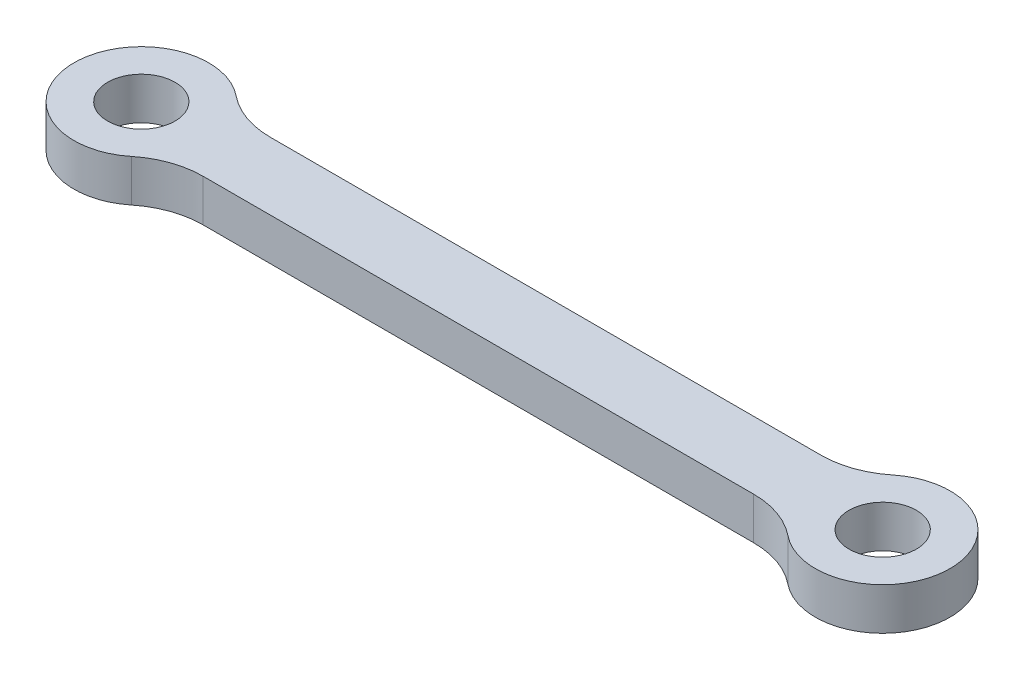
ISO-10303-21;
HEADER;
FILE_DESCRIPTION(('STEP AP214'),'2;1');
FILE_NAME('part.step','',(''),(''),'','','');
FILE_SCHEMA(('AUTOMOTIVE_DESIGN { 1 0 10303 214 1 1 1 1 }'));
ENDSEC;
DATA;
#1=APPLICATION_CONTEXT('core data for automotive mechanical design processes');
#2=APPLICATION_PROTOCOL_DEFINITION('international standard','automotive_design',2000,#1);
#3=PRODUCT_CONTEXT('',#1,'mechanical');
#4=PRODUCT('Part','Part','',(#3));
#5=PRODUCT_RELATED_PRODUCT_CATEGORY('part','',(#4));
#6=PRODUCT_DEFINITION_FORMATION('','',#4);
#7=PRODUCT_DEFINITION_CONTEXT('part definition',#1,'design');
#8=PRODUCT_DEFINITION('design','',#6,#7);
#9=PRODUCT_DEFINITION_SHAPE('','',#8);
#10=(LENGTH_UNIT() NAMED_UNIT(*) SI_UNIT(.MILLI.,.METRE.));
#11=(NAMED_UNIT(*) PLANE_ANGLE_UNIT() SI_UNIT($,.RADIAN.));
#12=(NAMED_UNIT(*) SI_UNIT($,.STERADIAN.) SOLID_ANGLE_UNIT());
#13=UNCERTAINTY_MEASURE_WITH_UNIT(LENGTH_MEASURE(1.E-05),#10,'distance_accuracy_value','');
#14=(GEOMETRIC_REPRESENTATION_CONTEXT(3) GLOBAL_UNCERTAINTY_ASSIGNED_CONTEXT((#13)) GLOBAL_UNIT_ASSIGNED_CONTEXT((#10,
#11,#12)) REPRESENTATION_CONTEXT('',''));
#15=CARTESIAN_POINT('',(0.,0.,0.));
#16=DIRECTION('',(0.,0.,1.));
#17=DIRECTION('',(1.,0.,0.));
#18=AXIS2_PLACEMENT_3D('',#15,#16,#17);
#19=CARTESIAN_POINT('',(-44.,5.,0.));
#20=DIRECTION('',(0.,1.,0.));
#21=DIRECTION('',(0.,0.,1.));
#22=AXIS2_PLACEMENT_3D('',#19,#20,#21);
#23=PLANE('',#22);
#24=CARTESIAN_POINT('',(-44.,5.,0.));
#25=DIRECTION('',(0.,1.,0.));
#26=DIRECTION('',(0.,0.,1.));
#27=AXIS2_PLACEMENT_3D('',#24,#25,#26);
#28=CIRCLE('',#27,4.);
#29=CARTESIAN_POINT('',(-44.,5.,4.));
#30=VERTEX_POINT('',#29);
#31=EDGE_CURVE('E161',#30,#30,#28,.T.);
#32=ORIENTED_EDGE('',*,*,#31,.F.);
#33=EDGE_LOOP('',(#32));
#34=FACE_BOUND('',#33,.T.);
#35=DIRECTION('',(-1.,0.,0.));
#36=VECTOR('',#35,1.);
#37=CARTESIAN_POINT('',(37.0717967697245,5.,-4.));
#38=LINE('',#37,#36);
#39=CARTESIAN_POINT('',(32.6862915010152,5.,-4.));
#40=VERTEX_POINT('',#39);
#41=CARTESIAN_POINT('',(-32.6862915010152,5.,-4.));
#42=VERTEX_POINT('',#41);
#43=EDGE_CURVE('E138',#40,#42,#38,.T.);
#44=ORIENTED_EDGE('',*,*,#43,.T.);
#45=CARTESIAN_POINT('',(-32.6862915010152,5.,-14.));
#46=DIRECTION('',(0.,1.,0.));
#47=DIRECTION('',(0.,0.,1.));
#48=AXIS2_PLACEMENT_3D('',#45,#46,#47);
#49=CIRCLE('',#48,10.);
#50=CARTESIAN_POINT('',(-38.9716851115623,5.,-6.22222222222222));
#51=VERTEX_POINT('',#50);
#52=EDGE_CURVE('E55',#42,#51,#49,.F.);
#53=ORIENTED_EDGE('',*,*,#52,.T.);
#54=CARTESIAN_POINT('',(-44.,5.,0.));
#55=DIRECTION('',(0.,1.,0.));
#56=DIRECTION('',(0.,0.,1.));
#57=AXIS2_PLACEMENT_3D('',#54,#55,#56);
#58=CIRCLE('',#57,8.);
#59=CARTESIAN_POINT('',(-38.9716851115623,5.,6.22222222222223));
#60=VERTEX_POINT('',#59);
#61=EDGE_CURVE('E132',#51,#60,#58,.T.);
#62=ORIENTED_EDGE('',*,*,#61,.T.);
#63=CARTESIAN_POINT('',(-32.6862915010152,5.,14.));
#64=DIRECTION('',(0.,1.,0.));
#65=DIRECTION('',(0.,0.,1.));
#66=AXIS2_PLACEMENT_3D('',#63,#64,#65);
#67=CIRCLE('',#66,10.);
#68=CARTESIAN_POINT('',(-32.6862915010152,5.,4.));
#69=VERTEX_POINT('',#68);
#70=EDGE_CURVE('E11',#60,#69,#67,.F.);
#71=ORIENTED_EDGE('',*,*,#70,.T.);
#72=DIRECTION('',(1.,0.,0.));
#73=VECTOR('',#72,1.);
#74=CARTESIAN_POINT('',(37.0717967697245,5.,3.99999999999999));
#75=LINE('',#74,#73);
#76=CARTESIAN_POINT('',(32.6862915010152,5.,3.99999999999999));
#77=VERTEX_POINT('',#76);
#78=EDGE_CURVE('E166',#69,#77,#75,.T.);
#79=ORIENTED_EDGE('',*,*,#78,.T.);
#80=CARTESIAN_POINT('',(32.6862915010152,5.,14.));
#81=DIRECTION('',(0.,1.,0.));
#82=DIRECTION('',(0.,0.,1.));
#83=AXIS2_PLACEMENT_3D('',#80,#81,#82);
#84=CIRCLE('',#83,10.);
#85=CARTESIAN_POINT('',(38.9716851115623,5.,6.22222222222221));
#86=VERTEX_POINT('',#85);
#87=EDGE_CURVE('E109',#77,#86,#84,.F.);
#88=ORIENTED_EDGE('',*,*,#87,.T.);
#89=CARTESIAN_POINT('',(44.,5.,0.));
#90=DIRECTION('',(0.,1.,0.));
#91=DIRECTION('',(0.,0.,-1.));
#92=AXIS2_PLACEMENT_3D('',#89,#90,#91);
#93=CIRCLE('',#92,7.99999999999999);
#94=CARTESIAN_POINT('',(38.9716851115623,5.,-6.22222222222222));
#95=VERTEX_POINT('',#94);
#96=EDGE_CURVE('E119',#86,#95,#93,.T.);
#97=ORIENTED_EDGE('',*,*,#96,.T.);
#98=CARTESIAN_POINT('',(32.6862915010152,5.,-14.));
#99=DIRECTION('',(0.,1.,0.));
#100=DIRECTION('',(0.,0.,1.));
#101=AXIS2_PLACEMENT_3D('',#98,#99,#100);
#102=CIRCLE('',#101,10.);
#103=EDGE_CURVE('E153',#95,#40,#102,.F.);
#104=ORIENTED_EDGE('',*,*,#103,.T.);
#105=EDGE_LOOP('',(#44,#53,#62,#71,#79,#88,#97,#104));
#106=FACE_BOUND('',#105,.T.);
#107=CARTESIAN_POINT('',(44.,5.,0.));
#108=DIRECTION('',(0.,1.,0.));
#109=DIRECTION('',(0.,0.,-1.));
#110=AXIS2_PLACEMENT_3D('',#107,#108,#109);
#111=CIRCLE('',#110,4.);
#112=CARTESIAN_POINT('',(44.,5.,-4.));
#113=VERTEX_POINT('',#112);
#114=EDGE_CURVE('E288',#113,#113,#111,.T.);
#115=ORIENTED_EDGE('',*,*,#114,.F.);
#116=EDGE_LOOP('',(#115));
#117=FACE_BOUND('',#116,.T.);
#118=ADVANCED_FACE('F33',(#34,#106,#117),#23,.T.);
#119=CARTESIAN_POINT('',(-44.,0.,0.));
#120=DIRECTION('',(0.,1.,0.));
#121=DIRECTION('',(0.,0.,1.));
#122=AXIS2_PLACEMENT_3D('',#119,#120,#121);
#123=PLANE('',#122);
#124=CARTESIAN_POINT('',(-44.,0.,0.));
#125=DIRECTION('',(0.,1.,0.));
#126=DIRECTION('',(0.,0.,1.));
#127=AXIS2_PLACEMENT_3D('',#124,#125,#126);
#128=CIRCLE('',#127,4.);
#129=CARTESIAN_POINT('',(-44.,0.,4.));
#130=VERTEX_POINT('',#129);
#131=EDGE_CURVE('E293',#130,#130,#128,.T.);
#132=ORIENTED_EDGE('',*,*,#131,.T.);
#133=EDGE_LOOP('',(#132));
#134=FACE_BOUND('',#133,.T.);
#135=CARTESIAN_POINT('',(-44.,0.,0.));
#136=DIRECTION('',(0.,1.,0.));
#137=DIRECTION('',(0.,0.,1.));
#138=AXIS2_PLACEMENT_3D('',#135,#136,#137);
#139=CIRCLE('',#138,8.);
#140=CARTESIAN_POINT('',(-38.9716851115623,0.,-6.22222222222222));
#141=VERTEX_POINT('',#140);
#142=CARTESIAN_POINT('',(-38.9716851115623,0.,6.22222222222223));
#143=VERTEX_POINT('',#142);
#144=EDGE_CURVE('E134',#141,#143,#139,.T.);
#145=ORIENTED_EDGE('',*,*,#144,.F.);
#146=CARTESIAN_POINT('',(-32.6862915010152,0.,-14.));
#147=DIRECTION('',(0.,1.,0.));
#148=DIRECTION('',(0.,0.,1.));
#149=AXIS2_PLACEMENT_3D('',#146,#147,#148);
#150=CIRCLE('',#149,10.);
#151=CARTESIAN_POINT('',(-32.6862915010152,0.,-4.));
#152=VERTEX_POINT('',#151);
#153=EDGE_CURVE('E155',#141,#152,#150,.T.);
#154=ORIENTED_EDGE('',*,*,#153,.T.);
#155=DIRECTION('',(-1.,0.,0.));
#156=VECTOR('',#155,1.);
#157=CARTESIAN_POINT('',(37.0717967697245,0.,-4.));
#158=LINE('',#157,#156);
#159=CARTESIAN_POINT('',(32.6862915010152,0.,-4.));
#160=VERTEX_POINT('',#159);
#161=EDGE_CURVE('E128',#160,#152,#158,.T.);
#162=ORIENTED_EDGE('',*,*,#161,.F.);
#163=CARTESIAN_POINT('',(32.6862915010152,0.,-14.));
#164=DIRECTION('',(0.,1.,0.));
#165=DIRECTION('',(0.,0.,1.));
#166=AXIS2_PLACEMENT_3D('',#163,#164,#165);
#167=CIRCLE('',#166,10.);
#168=CARTESIAN_POINT('',(38.9716851115623,0.,-6.22222222222222));
#169=VERTEX_POINT('',#168);
#170=EDGE_CURVE('E127',#160,#169,#167,.T.);
#171=ORIENTED_EDGE('',*,*,#170,.T.);
#172=CARTESIAN_POINT('',(44.,0.,0.));
#173=DIRECTION('',(0.,1.,0.));
#174=DIRECTION('',(0.,0.,-1.));
#175=AXIS2_PLACEMENT_3D('',#172,#173,#174);
#176=CIRCLE('',#175,7.99999999999999);
#177=CARTESIAN_POINT('',(38.9716851115623,0.,6.22222222222221));
#178=VERTEX_POINT('',#177);
#179=EDGE_CURVE('E116',#178,#169,#176,.T.);
#180=ORIENTED_EDGE('',*,*,#179,.F.);
#181=CARTESIAN_POINT('',(32.6862915010152,0.,14.));
#182=DIRECTION('',(0.,1.,0.));
#183=DIRECTION('',(0.,0.,1.));
#184=AXIS2_PLACEMENT_3D('',#181,#182,#183);
#185=CIRCLE('',#184,10.);
#186=CARTESIAN_POINT('',(32.6862915010152,0.,3.99999999999999));
#187=VERTEX_POINT('',#186);
#188=EDGE_CURVE('E99',#178,#187,#185,.T.);
#189=ORIENTED_EDGE('',*,*,#188,.T.);
#190=DIRECTION('',(1.,0.,0.));
#191=VECTOR('',#190,1.);
#192=CARTESIAN_POINT('',(37.0717967697245,0.,3.99999999999999));
#193=LINE('',#192,#191);
#194=CARTESIAN_POINT('',(-32.6862915010152,0.,4.));
#195=VERTEX_POINT('',#194);
#196=EDGE_CURVE('E129',#195,#187,#193,.T.);
#197=ORIENTED_EDGE('',*,*,#196,.F.);
#198=CARTESIAN_POINT('',(-32.6862915010152,0.,14.));
#199=DIRECTION('',(0.,1.,0.));
#200=DIRECTION('',(0.,0.,1.));
#201=AXIS2_PLACEMENT_3D('',#198,#199,#200);
#202=CIRCLE('',#201,10.);
#203=EDGE_CURVE('E41',#195,#143,#202,.T.);
#204=ORIENTED_EDGE('',*,*,#203,.T.);
#205=EDGE_LOOP('',(#145,#154,#162,#171,#180,#189,#197,#204));
#206=FACE_BOUND('',#205,.T.);
#207=CARTESIAN_POINT('',(44.,0.,0.));
#208=DIRECTION('',(0.,1.,0.));
#209=DIRECTION('',(0.,0.,-1.));
#210=AXIS2_PLACEMENT_3D('',#207,#208,#209);
#211=CIRCLE('',#210,4.);
#212=CARTESIAN_POINT('',(44.,0.,-4.));
#213=VERTEX_POINT('',#212);
#214=EDGE_CURVE('E291',#213,#213,#211,.T.);
#215=ORIENTED_EDGE('',*,*,#214,.T.);
#216=EDGE_LOOP('',(#215));
#217=FACE_BOUND('',#216,.T.);
#218=ADVANCED_FACE('F124',(#134,#206,#217),#123,.F.);
#219=CARTESIAN_POINT('',(-44.,5.,0.));
#220=DIRECTION('',(0.,-1.,0.));
#221=DIRECTION('',(0.,0.,-1.));
#222=AXIS2_PLACEMENT_3D('',#219,#220,#221);
#223=CYLINDRICAL_SURFACE('',#222,8.);
#224=ORIENTED_EDGE('',*,*,#61,.F.);
#225=DIRECTION('',(0.,-1.,0.));
#226=VECTOR('',#225,1.);
#227=CARTESIAN_POINT('',(-38.9716851115623,5.,-6.22222222222222));
#228=LINE('',#227,#226);
#229=EDGE_CURVE('E110',#51,#141,#228,.T.);
#230=ORIENTED_EDGE('',*,*,#229,.T.);
#231=ORIENTED_EDGE('',*,*,#144,.T.);
#232=DIRECTION('',(0.,-1.,0.));
#233=VECTOR('',#232,1.);
#234=CARTESIAN_POINT('',(-38.9716851115623,5.,6.22222222222223));
#235=LINE('',#234,#233);
#236=EDGE_CURVE('E48',#143,#60,#235,.F.);
#237=ORIENTED_EDGE('',*,*,#236,.T.);
#238=EDGE_LOOP('',(#224,#230,#231,#237));
#239=FACE_BOUND('',#238,.T.);
#240=ADVANCED_FACE('F159',(#239),#223,.T.);
#241=CARTESIAN_POINT('',(37.0717967697245,5.,3.99999999999999));
#242=DIRECTION('',(0.,0.,-1.));
#243=DIRECTION('',(-1.,0.,0.));
#244=AXIS2_PLACEMENT_3D('',#241,#242,#243);
#245=PLANE('',#244);
#246=ORIENTED_EDGE('',*,*,#196,.T.);
#247=DIRECTION('',(0.,1.,0.));
#248=VECTOR('',#247,1.);
#249=CARTESIAN_POINT('',(32.6862915010152,5.,3.99999999999999));
#250=LINE('',#249,#248);
#251=EDGE_CURVE('E104',#187,#77,#250,.T.);
#252=ORIENTED_EDGE('',*,*,#251,.T.);
#253=ORIENTED_EDGE('',*,*,#78,.F.);
#254=DIRECTION('',(0.,1.,0.));
#255=VECTOR('',#254,1.);
#256=CARTESIAN_POINT('',(-32.6862915010152,0.,4.));
#257=LINE('',#256,#255);
#258=EDGE_CURVE('E120',#69,#195,#257,.F.);
#259=ORIENTED_EDGE('',*,*,#258,.T.);
#260=EDGE_LOOP('',(#246,#252,#253,#259));
#261=FACE_BOUND('',#260,.T.);
#262=ADVANCED_FACE('F168',(#261),#245,.F.);
#263=CARTESIAN_POINT('',(44.,5.,0.));
#264=DIRECTION('',(0.,-1.,0.));
#265=DIRECTION('',(0.,0.,-1.));
#266=AXIS2_PLACEMENT_3D('',#263,#264,#265);
#267=CYLINDRICAL_SURFACE('',#266,7.99999999999999);
#268=ORIENTED_EDGE('',*,*,#96,.F.);
#269=DIRECTION('',(0.,-1.,0.));
#270=VECTOR('',#269,1.);
#271=CARTESIAN_POINT('',(38.9716851115623,5.,6.22222222222221));
#272=LINE('',#271,#270);
#273=EDGE_CURVE('E103',#86,#178,#272,.T.);
#274=ORIENTED_EDGE('',*,*,#273,.T.);
#275=ORIENTED_EDGE('',*,*,#179,.T.);
#276=DIRECTION('',(0.,-1.,0.));
#277=VECTOR('',#276,1.);
#278=CARTESIAN_POINT('',(38.9716851115623,5.,-6.22222222222222));
#279=LINE('',#278,#277);
#280=EDGE_CURVE('E121',#169,#95,#279,.F.);
#281=ORIENTED_EDGE('',*,*,#280,.T.);
#282=EDGE_LOOP('',(#268,#274,#275,#281));
#283=FACE_BOUND('',#282,.T.);
#284=ADVANCED_FACE('F115',(#283),#267,.T.);
#285=CARTESIAN_POINT('',(37.0717967697245,5.,-4.));
#286=DIRECTION('',(0.,0.,1.));
#287=DIRECTION('',(1.,0.,0.));
#288=AXIS2_PLACEMENT_3D('',#285,#286,#287);
#289=PLANE('',#288);
#290=ORIENTED_EDGE('',*,*,#43,.F.);
#291=DIRECTION('',(0.,1.,0.));
#292=VECTOR('',#291,1.);
#293=CARTESIAN_POINT('',(32.6862915010152,0.,-4.));
#294=LINE('',#293,#292);
#295=EDGE_CURVE('E145',#40,#160,#294,.F.);
#296=ORIENTED_EDGE('',*,*,#295,.T.);
#297=ORIENTED_EDGE('',*,*,#161,.T.);
#298=DIRECTION('',(0.,1.,0.));
#299=VECTOR('',#298,1.);
#300=CARTESIAN_POINT('',(-32.6862915010152,5.,-4.));
#301=LINE('',#300,#299);
#302=EDGE_CURVE('E143',#152,#42,#301,.T.);
#303=ORIENTED_EDGE('',*,*,#302,.T.);
#304=EDGE_LOOP('',(#290,#296,#297,#303));
#305=FACE_BOUND('',#304,.T.);
#306=ADVANCED_FACE('F181',(#305),#289,.F.);
#307=CARTESIAN_POINT('',(-44.,5.,0.));
#308=DIRECTION('',(0.,-1.,0.));
#309=DIRECTION('',(0.,0.,-1.));
#310=AXIS2_PLACEMENT_3D('',#307,#308,#309);
#311=CYLINDRICAL_SURFACE('',#310,4.);
#312=ORIENTED_EDGE('',*,*,#31,.T.);
#313=EDGE_LOOP('',(#312));
#314=FACE_BOUND('',#313,.T.);
#315=ORIENTED_EDGE('',*,*,#131,.F.);
#316=EDGE_LOOP('',(#315));
#317=FACE_BOUND('',#316,.T.);
#318=ADVANCED_FACE('F202',(#314,#317),#311,.F.);
#319=CARTESIAN_POINT('',(44.,5.,0.));
#320=DIRECTION('',(0.,-1.,0.));
#321=DIRECTION('',(0.,0.,-1.));
#322=AXIS2_PLACEMENT_3D('',#319,#320,#321);
#323=CYLINDRICAL_SURFACE('',#322,4.);
#324=ORIENTED_EDGE('',*,*,#114,.T.);
#325=EDGE_LOOP('',(#324));
#326=FACE_BOUND('',#325,.T.);
#327=ORIENTED_EDGE('',*,*,#214,.F.);
#328=EDGE_LOOP('',(#327));
#329=FACE_BOUND('',#328,.T.);
#330=ADVANCED_FACE('F190',(#326,#329),#323,.F.);
#331=CARTESIAN_POINT('',(32.6862915010152,5.,14.));
#332=DIRECTION('',(0.,-1.,0.));
#333=DIRECTION('',(0.,0.,-1.));
#334=AXIS2_PLACEMENT_3D('',#331,#332,#333);
#335=CYLINDRICAL_SURFACE('',#334,10.);
#336=ORIENTED_EDGE('',*,*,#87,.F.);
#337=ORIENTED_EDGE('',*,*,#251,.F.);
#338=ORIENTED_EDGE('',*,*,#188,.F.);
#339=ORIENTED_EDGE('',*,*,#273,.F.);
#340=EDGE_LOOP('',(#336,#337,#338,#339));
#341=FACE_BOUND('',#340,.T.);
#342=ADVANCED_FACE('F102',(#341),#335,.F.);
#343=CARTESIAN_POINT('',(32.6862915010152,5.,-14.));
#344=DIRECTION('',(0.,-1.,0.));
#345=DIRECTION('',(0.,0.,-1.));
#346=AXIS2_PLACEMENT_3D('',#343,#344,#345);
#347=CYLINDRICAL_SURFACE('',#346,10.);
#348=ORIENTED_EDGE('',*,*,#103,.F.);
#349=ORIENTED_EDGE('',*,*,#280,.F.);
#350=ORIENTED_EDGE('',*,*,#170,.F.);
#351=ORIENTED_EDGE('',*,*,#295,.F.);
#352=EDGE_LOOP('',(#348,#349,#350,#351));
#353=FACE_BOUND('',#352,.T.);
#354=ADVANCED_FACE('F183',(#353),#347,.F.);
#355=CARTESIAN_POINT('',(-32.6862915010152,5.,-14.));
#356=DIRECTION('',(0.,-1.,0.));
#357=DIRECTION('',(0.,0.,-1.));
#358=AXIS2_PLACEMENT_3D('',#355,#356,#357);
#359=CYLINDRICAL_SURFACE('',#358,10.);
#360=ORIENTED_EDGE('',*,*,#52,.F.);
#361=ORIENTED_EDGE('',*,*,#302,.F.);
#362=ORIENTED_EDGE('',*,*,#153,.F.);
#363=ORIENTED_EDGE('',*,*,#229,.F.);
#364=EDGE_LOOP('',(#360,#361,#362,#363));
#365=FACE_BOUND('',#364,.T.);
#366=ADVANCED_FACE('F180',(#365),#359,.F.);
#367=CARTESIAN_POINT('',(-32.6862915010152,5.,14.));
#368=DIRECTION('',(0.,-1.,0.));
#369=DIRECTION('',(0.,0.,-1.));
#370=AXIS2_PLACEMENT_3D('',#367,#368,#369);
#371=CYLINDRICAL_SURFACE('',#370,10.);
#372=ORIENTED_EDGE('',*,*,#70,.F.);
#373=ORIENTED_EDGE('',*,*,#236,.F.);
#374=ORIENTED_EDGE('',*,*,#203,.F.);
#375=ORIENTED_EDGE('',*,*,#258,.F.);
#376=EDGE_LOOP('',(#372,#373,#374,#375));
#377=FACE_BOUND('',#376,.T.);
#378=ADVANCED_FACE('F35',(#377),#371,.F.);
#379=CLOSED_SHELL('',(#118,#218,#240,#262,#284,#306,#318,#330,#342,#354,#366,#378));
#380=MANIFOLD_SOLID_BREP('B2',#379);
#381=ADVANCED_BREP_SHAPE_REPRESENTATION('',(#18,#380),#14);
#382=SHAPE_DEFINITION_REPRESENTATION(#9,#381);
ENDSEC;
END-ISO-10303-21;
